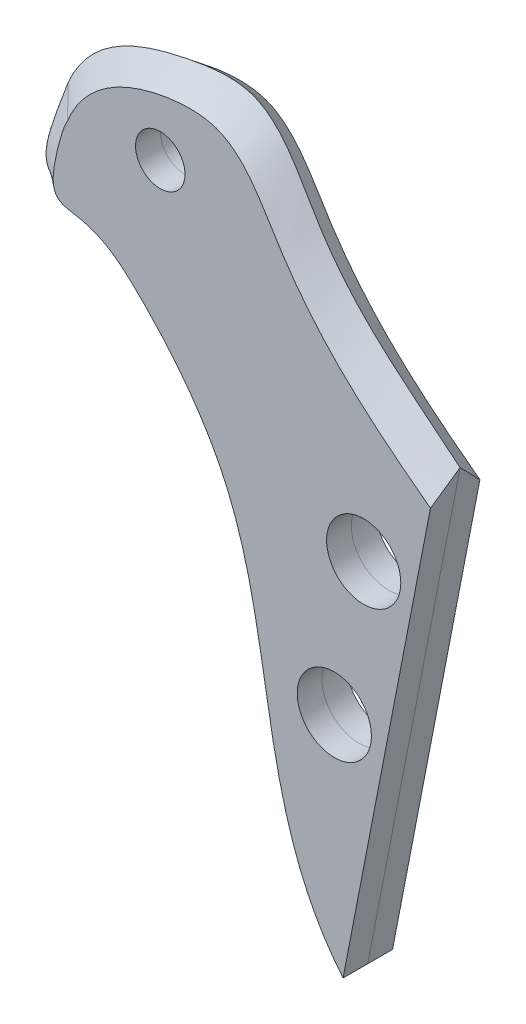
ISO-10303-21;
HEADER;
FILE_DESCRIPTION(('STEP AP214'),'2;1');
FILE_NAME('part.step','',(''),(''),'','','');
FILE_SCHEMA(('AUTOMOTIVE_DESIGN { 1 0 10303 214 1 1 1 1 }'));
ENDSEC;
DATA;
#1=APPLICATION_CONTEXT('core data for automotive mechanical design processes');
#2=APPLICATION_PROTOCOL_DEFINITION('international standard','automotive_design',2000,#1);
#3=PRODUCT_CONTEXT('',#1,'mechanical');
#4=PRODUCT('Part','Part','',(#3));
#5=PRODUCT_RELATED_PRODUCT_CATEGORY('part','',(#4));
#6=PRODUCT_DEFINITION_FORMATION('','',#4);
#7=PRODUCT_DEFINITION_CONTEXT('part definition',#1,'design');
#8=PRODUCT_DEFINITION('design','',#6,#7);
#9=PRODUCT_DEFINITION_SHAPE('','',#8);
#10=(LENGTH_UNIT() NAMED_UNIT(*) SI_UNIT(.MILLI.,.METRE.));
#11=(NAMED_UNIT(*) PLANE_ANGLE_UNIT() SI_UNIT($,.RADIAN.));
#12=(NAMED_UNIT(*) SI_UNIT($,.STERADIAN.) SOLID_ANGLE_UNIT());
#13=UNCERTAINTY_MEASURE_WITH_UNIT(LENGTH_MEASURE(1.E-05),#10,'distance_accuracy_value','');
#14=(GEOMETRIC_REPRESENTATION_CONTEXT(3) GLOBAL_UNCERTAINTY_ASSIGNED_CONTEXT((#13)) GLOBAL_UNIT_ASSIGNED_CONTEXT((#10,
#11,#12)) REPRESENTATION_CONTEXT('',''));
#15=CARTESIAN_POINT('',(0.,0.,0.));
#16=DIRECTION('',(0.,0.,1.));
#17=DIRECTION('',(1.,0.,0.));
#18=AXIS2_PLACEMENT_3D('',#15,#16,#17);
#19=CARTESIAN_POINT('',(0.,0.,30.013289283743));
#20=DIRECTION('',(0.,0.,-1.));
#21=DIRECTION('',(-1.,0.,0.));
#22=AXIS2_PLACEMENT_3D('',#19,#20,#21);
#23=PLANE('',#22);
#24=CARTESIAN_POINT('',(40.2778882950094,12.0174412329978,30.013289283743));
#25=DIRECTION('',(0.,0.,-1.));
#26=DIRECTION('',(-1.,0.,0.));
#27=AXIS2_PLACEMENT_3D('',#24,#25,#26);
#28=CIRCLE('',#27,1.7);
#29=CARTESIAN_POINT('',(38.5778882950094,12.0174412329978,30.013289283743));
#30=VERTEX_POINT('',#29);
#31=EDGE_CURVE('E248',#30,#30,#28,.F.);
#32=ORIENTED_EDGE('',*,*,#31,.T.);
#33=EDGE_LOOP('',(#32));
#34=FACE_BOUND('',#33,.T.);
#35=CARTESIAN_POINT('',(52.2416782887102,-15.017432758745,30.013289283743));
#36=DIRECTION('',(0.,0.,-1.));
#37=DIRECTION('',(-1.,0.,0.));
#38=AXIS2_PLACEMENT_3D('',#35,#36,#37);
#39=CIRCLE('',#38,2.54999999999999);
#40=CARTESIAN_POINT('',(49.6916782887102,-15.017432758745,30.013289283743));
#41=VERTEX_POINT('',#40);
#42=EDGE_CURVE('E180',#41,#41,#39,.F.);
#43=ORIENTED_EDGE('',*,*,#42,.T.);
#44=EDGE_LOOP('',(#43));
#45=FACE_BOUND('',#44,.T.);
#46=CARTESIAN_POINT('',(59.1866082842384,2.31655029087227,30.013289283743));
#47=CARTESIAN_POINT('',(55.5333547569396,5.37200350174671,30.013289283743));
#48=CARTESIAN_POINT('',(50.3563460795847,8.97370204998886,30.013289283743));
#49=CARTESIAN_POINT('',(46.4228075177713,18.1170294651366,30.013289283743));
#50=CARTESIAN_POINT('',(38.3922126218077,17.1644202277484,30.013289283743));
#51=CARTESIAN_POINT('',(33.8009564372788,15.3919532379688,30.013289283743));
#52=CARTESIAN_POINT('',(32.2359920814305,11.7483802516687,30.013289283743));
#53=B_SPLINE_CURVE_WITH_KNOTS('',3,(#46,#47,#48,#49,#50,#51,#52),.UNSPECIFIED.,.F.,.F.,(4,1,1,1,
4),(0.,0.379573755906784,0.583156846162769,0.702934632684244,1.),.UNSPECIFIED.);
#54=CARTESIAN_POINT('',(59.1866082842384,2.31655029087227,30.013289283743));
#55=VERTEX_POINT('',#54);
#56=CARTESIAN_POINT('',(32.2359920814305,11.7483802516687,30.013289283743));
#57=VERTEX_POINT('',#56);
#58=EDGE_CURVE('E61',#55,#57,#53,.T.);
#59=ORIENTED_EDGE('',*,*,#58,.F.);
#60=DIRECTION('',(-0.190360349727866,-0.98171428493808,0.));
#61=VECTOR('',#60,1.);
#62=CARTESIAN_POINT('',(57.4834926467632,-6.46664932291833,30.013289283743));
#63=LINE('',#62,#61);
#64=CARTESIAN_POINT('',(52.8448032906845,-30.3890029578152,30.013289283743));
#65=VERTEX_POINT('',#64);
#66=EDGE_CURVE('E95',#55,#65,#63,.T.);
#67=ORIENTED_EDGE('',*,*,#66,.T.);
#68=CARTESIAN_POINT('',(32.2359920814305,11.7483802516687,30.013289283743));
#69=CARTESIAN_POINT('',(32.0391638031607,11.1977834179729,30.013289283743));
#70=CARTESIAN_POINT('',(31.1172750102454,8.89558190594387,30.013289283743));
#71=CARTESIAN_POINT('',(30.1766496252198,5.20290054989083,30.013289283743));
#72=CARTESIAN_POINT('',(35.0316263190903,4.78377688389193,30.013289283743));
#73=CARTESIAN_POINT('',(39.758918338248,1.56715151651564,30.013289283743));
#74=CARTESIAN_POINT('',(47.9191438448916,-10.1862882712879,30.013289283743));
#75=CARTESIAN_POINT('',(46.7945352629169,-23.0216187639972,30.013289283743));
#76=CARTESIAN_POINT('',(52.8448032906845,-30.3890029578152,30.013289283743));
#77=B_SPLINE_CURVE_WITH_KNOTS('',3,(#68,#69,#70,#71,#72,#73,#74,#75,#76),.UNSPECIFIED.,.F.,.F.,
(4,1,1,1,1,1,4),(0.,0.0634739836974081,0.118425301735854,0.193565341111615,0.283413176700978,
0.473561281053638,1.),.UNSPECIFIED.);
#78=EDGE_CURVE('E13',#57,#65,#77,.T.);
#79=ORIENTED_EDGE('',*,*,#78,.F.);
#80=EDGE_LOOP('',(#59,#67,#79));
#81=FACE_BOUND('',#80,.T.);
#82=CARTESIAN_POINT('',(54.2604282887102,-4.8890029578152,30.013289283743));
#83=DIRECTION('',(0.,0.,-1.));
#84=DIRECTION('',(-1.,0.,0.));
#85=AXIS2_PLACEMENT_3D('',#82,#83,#84);
#86=CIRCLE('',#85,2.55);
#87=CARTESIAN_POINT('',(51.7104282887101,-4.8890029578152,30.013289283743));
#88=VERTEX_POINT('',#87);
#89=EDGE_CURVE('E253',#88,#88,#86,.F.);
#90=ORIENTED_EDGE('',*,*,#89,.T.);
#91=EDGE_LOOP('',(#90));
#92=FACE_BOUND('',#91,.T.);
#93=ADVANCED_FACE('F52',(#34,#45,#81,#92),#23,.T.);
#94=CARTESIAN_POINT('',(57.4834926467632,-6.46664932291833,17.730789283743));
#95=DIRECTION('',(-0.981714284938079,0.190360349727866,0.));
#96=DIRECTION('',(-0.190360349727866,-0.98171428493808,0.));
#97=AXIS2_PLACEMENT_3D('',#94,#95,#96);
#98=PLANE('',#97);
#99=ORIENTED_EDGE('',*,*,#66,.F.);
#100=DIRECTION('',(0.137169592660813,0.707402296574711,-0.693373271514046));
#101=VECTOR('',#100,1.);
#102=CARTESIAN_POINT('',(59.0184533256443,1.44935223638781,30.863289283743));
#103=LINE('',#102,#101);
#104=CARTESIAN_POINT('',(58.8502983670502,0.582154181903358,31.713289283743));
#105=VERTEX_POINT('',#104);
#106=EDGE_CURVE('E88',#105,#55,#103,.T.);
#107=ORIENTED_EDGE('',*,*,#106,.F.);
#108=DIRECTION('',(0.190360349727867,0.981714284938079,0.));
#109=VECTOR('',#108,1.);
#110=CARTESIAN_POINT('',(58.8502983670502,0.582154181903358,31.713289283743));
#111=LINE('',#110,#109);
#112=CARTESIAN_POINT('',(52.8448032906845,-30.3890029578152,31.713289283743));
#113=VERTEX_POINT('',#112);
#114=EDGE_CURVE('E93',#113,#105,#111,.T.);
#115=ORIENTED_EDGE('',*,*,#114,.F.);
#116=DIRECTION('',(0.,0.,1.));
#117=VECTOR('',#116,1.);
#118=CARTESIAN_POINT('',(52.8448032906845,-30.3890029578152,30.863289283743));
#119=LINE('',#118,#117);
#120=EDGE_CURVE('E166',#65,#113,#119,.T.);
#121=ORIENTED_EDGE('',*,*,#120,.F.);
#122=EDGE_LOOP('',(#99,#107,#115,#121));
#123=FACE_BOUND('',#122,.T.);
#124=ADVANCED_FACE('F90',(#123),#98,.F.);
#125=CARTESIAN_POINT('',(45.6690504757318,-7.32977099782672,31.713289283743));
#126=DIRECTION('',(0.,0.,-1.));
#127=DIRECTION('',(-1.,0.,0.));
#128=AXIS2_PLACEMENT_3D('',#125,#126,#127);
#129=PLANE('',#128);
#130=CARTESIAN_POINT('',(52.2416782887102,-15.017432758745,31.713289283743));
#131=DIRECTION('',(0.,0.,1.));
#132=DIRECTION('',(1.,0.,0.));
#133=AXIS2_PLACEMENT_3D('',#130,#131,#132);
#134=CIRCLE('',#133,2.54999999999999);
#135=CARTESIAN_POINT('',(54.7916782887101,-15.017432758745,31.713289283743));
#136=VERTEX_POINT('',#135);
#137=EDGE_CURVE('E167',#136,#136,#134,.T.);
#138=ORIENTED_EDGE('',*,*,#137,.F.);
#139=EDGE_LOOP('',(#138));
#140=FACE_BOUND('',#139,.T.);
#141=CARTESIAN_POINT('',(54.2604282887102,-4.8890029578152,31.713289283743));
#142=DIRECTION('',(0.,0.,1.));
#143=DIRECTION('',(1.,0.,0.));
#144=AXIS2_PLACEMENT_3D('',#141,#142,#143);
#145=CIRCLE('',#144,2.55);
#146=CARTESIAN_POINT('',(56.8104282887102,-4.8890029578152,31.713289283743));
#147=VERTEX_POINT('',#146);
#148=EDGE_CURVE('E239',#147,#147,#145,.T.);
#149=ORIENTED_EDGE('',*,*,#148,.F.);
#150=EDGE_LOOP('',(#149));
#151=FACE_BOUND('',#150,.T.);
#152=CARTESIAN_POINT('',(40.2778882950094,12.0174412329978,31.713289283743));
#153=DIRECTION('',(0.,0.,-1.));
#154=DIRECTION('',(-1.,0.,0.));
#155=AXIS2_PLACEMENT_3D('',#152,#153,#154);
#156=CIRCLE('',#155,1.7);
#157=CARTESIAN_POINT('',(38.5778882950094,12.0174412329978,31.713289283743));
#158=VERTEX_POINT('',#157);
#159=EDGE_CURVE('E97',#158,#158,#156,.T.);
#160=ORIENTED_EDGE('',*,*,#159,.T.);
#161=EDGE_LOOP('',(#160));
#162=FACE_BOUND('',#161,.T.);
#163=CARTESIAN_POINT('',(33.9072419780726,11.1608982302468,31.713289283743));
#164=CARTESIAN_POINT('',(33.6960790230969,10.8900327996302,31.713289283743));
#165=CARTESIAN_POINT('',(32.9632999997767,8.60805804038253,31.713289283743));
#166=CARTESIAN_POINT('',(32.7656863797307,5.95017231439694,31.713289283743));
#167=CARTESIAN_POINT('',(36.0475396281196,5.77660384822842,31.713289283743));
#168=CARTESIAN_POINT('',(40.1509390488213,2.23022416718721,31.713289283743));
#169=CARTESIAN_POINT('',(49.0161937001583,-8.99625873655049,31.713289283743));
#170=CARTESIAN_POINT('',(46.7768600490162,-23.0929190605882,31.713289283743));
#171=CARTESIAN_POINT('',(52.8448032906845,-30.3890029578152,31.713289283743));
#172=B_SPLINE_CURVE_WITH_KNOTS('',3,(#163,#164,#165,#166,#167,#168,#169,#170,#171),
.UNSPECIFIED.,.F.,.F.,(4,1,1,1,1,1,4),(0.,0.0618691743171781,0.104877433914272,
0.140990087097665,0.232652655485206,0.44215472429863,1.),.UNSPECIFIED.);
#173=CARTESIAN_POINT('',(33.9072419780726,11.1608982302468,31.713289283743));
#174=VERTEX_POINT('',#173);
#175=EDGE_CURVE('E113',#174,#113,#172,.T.);
#176=ORIENTED_EDGE('',*,*,#175,.T.);
#177=ORIENTED_EDGE('',*,*,#114,.T.);
#178=CARTESIAN_POINT('',(58.8502983670502,0.582154181903358,31.713289283743));
#179=CARTESIAN_POINT('',(54.6375536116588,3.72911890341942,31.713289283743));
#180=CARTESIAN_POINT('',(49.7861220121252,7.82016955184531,31.713289283743));
#181=CARTESIAN_POINT('',(45.5580551972648,16.2243115229969,31.713289283743));
#182=CARTESIAN_POINT('',(38.8669179019402,16.1253118462174,31.713289283743));
#183=CARTESIAN_POINT('',(35.0563370192907,14.0514408900861,31.713289283743));
#184=CARTESIAN_POINT('',(33.9072419780726,11.1608982302468,31.713289283743));
#185=B_SPLINE_CURVE_WITH_KNOTS('',3,(#178,#179,#180,#181,#182,#183,#184),.UNSPECIFIED.,.F.,.F.,
(4,1,1,1,4),(0.,0.443669854560584,0.631844867473527,0.739701273066536,1.),.UNSPECIFIED.);
#186=EDGE_CURVE('E101',#105,#174,#185,.T.);
#187=ORIENTED_EDGE('',*,*,#186,.T.);
#188=EDGE_LOOP('',(#176,#177,#187));
#189=FACE_BOUND('',#188,.T.);
#190=ADVANCED_FACE('F112',(#140,#151,#162,#189),#129,.F.);
#191=CARTESIAN_POINT('',(32.2359920814305,11.7483802516687,30.013289283743));
#192=CARTESIAN_POINT('',(33.9072419780726,11.1608982302468,31.713289283743));
#193=CARTESIAN_POINT('',(32.0441402021333,11.2117041286637,30.013289283743));
#194=CARTESIAN_POINT('',(33.6960790230969,10.8900327996302,31.713289283743));
#195=CARTESIAN_POINT('',(31.5575395421801,9.99503953999069,30.013289283743));
#196=CARTESIAN_POINT('',(33.252586061417,9.5089346619242,31.713289283743));
#197=CARTESIAN_POINT('',(30.901384361174,7.97609570288549,30.013289283743));
#198=CARTESIAN_POINT('',(32.8743340025538,7.41147323989284,31.713289283743));
#199=CARTESIAN_POINT('',(30.6076260406025,6.89481594928121,30.013289283743));
#200=CARTESIAN_POINT('',(32.8187157287241,6.36576028868581,31.713289283743));
#201=CARTESIAN_POINT('',(30.8954084548017,5.83965979232856,30.013289283743));
#202=CARTESIAN_POINT('',(33.8524947128075,5.89269391999161,31.713289283743));
#203=CARTESIAN_POINT('',(31.8877538184674,5.05518320589504,30.013289283743));
#204=CARTESIAN_POINT('',(35.4904654784108,5.71324151605375,31.713289283743));
#205=CARTESIAN_POINT('',(34.2723296968009,4.7257787669229,30.013289283743));
#206=CARTESIAN_POINT('',(37.126538770345,4.84407443991782,31.713289283743));
#207=CARTESIAN_POINT('',(36.5521313909395,3.74916866305139,30.013289283743));
#208=CARTESIAN_POINT('',(38.8133976572541,3.28302426988339,31.713289283743));
#209=CARTESIAN_POINT('',(39.7503754207592,1.30612283839873,30.013289283743));
#210=CARTESIAN_POINT('',(41.6207904889491,0.368883155269356,31.713289283743));
#211=CARTESIAN_POINT('',(42.2743675479331,-2.05593228199478,30.013289283743));
#212=CARTESIAN_POINT('',(43.8960701658193,-2.86406152662291,31.713289283743));
#213=CARTESIAN_POINT('',(47.6700154756001,-13.0296286176255,30.013289283743));
#214=CARTESIAN_POINT('',(48.3131551141228,-13.4219038997801,31.713289283743));
#215=CARTESIAN_POINT('',(46.7945352629169,-23.0216187639972,30.013289283743));
#216=CARTESIAN_POINT('',(47.1184838147925,-23.5036868540762,31.713289283743));
#217=CARTESIAN_POINT('',(52.8448032906845,-30.3890029578152,30.013289283743));
#218=CARTESIAN_POINT('',(52.8448032906845,-30.3890029578152,31.713289283743));
#219=B_SPLINE_SURFACE_WITH_KNOTS('',3,1,((#191,#192),(#193,#194),(#195,#196),(#197,#198),(#199,
#200),(#201,#202),(#203,#204),(#205,#206),(#207,#208),(#209,#210),(#211,#212),(#213,#214),(#215,
#216),(#217,#218)),.UNSPECIFIED.,.F.,.F.,.F.,(4,1,1,1,1,1,1,1,1,1,1,4),(2,2),(0.,
0.0618691743171781,0.0634739836974081,0.104877433914272,0.118425301735854,0.140990087097665,
0.193565341111615,0.232652655485206,0.283413176700978,0.44215472429863,0.473561281053638,1.),
(0.,1.),.UNSPECIFIED.);
#220=DIRECTION('',(0.680686533146075,-0.239276664280315,0.692396217150602));
#221=VECTOR('',#220,1.);
#222=CARTESIAN_POINT('',(33.0716170297516,11.4546392409578,30.863289283743));
#223=LINE('',#222,#221);
#224=EDGE_CURVE('E98',#57,#174,#223,.T.);
#225=ORIENTED_EDGE('',*,*,#78,.T.);
#226=ORIENTED_EDGE('',*,*,#120,.T.);
#227=ORIENTED_EDGE('',*,*,#175,.F.);
#228=ORIENTED_EDGE('',*,*,#224,.F.);
#229=EDGE_LOOP('',(#225,#226,#227,#228));
#230=FACE_BOUND('',#229,.T.);
#231=ADVANCED_FACE('F132',(#230),#219,.T.);
#232=CARTESIAN_POINT('',(59.1866082842384,2.31655029087227,30.013289283743));
#233=CARTESIAN_POINT('',(58.8502983670502,0.582154181903358,31.713289283743));
#234=CARTESIAN_POINT('',(55.5333547569396,5.37200350174671,30.013289283743));
#235=CARTESIAN_POINT('',(55.2461604409695,3.2744831890996,31.713289283743));
#236=CARTESIAN_POINT('',(51.5946499264045,8.11220124028726,30.013289283743));
#237=CARTESIAN_POINT('',(51.7231101959465,6.18677194480138,31.713289283743));
#238=CARTESIAN_POINT('',(47.8736223660526,14.744677836155,30.013289283743));
#239=CARTESIAN_POINT('',(47.9329539294505,11.6745344007484,31.713289283743));
#240=CARTESIAN_POINT('',(46.0945183802308,17.2988517696202,30.013289283743));
#241=CARTESIAN_POINT('',(46.4528492452718,14.4457265233554,31.713289283743));
#242=CARTESIAN_POINT('',(43.1574925504654,17.729689642728,30.013289283743));
#243=CARTESIAN_POINT('',(44.1998997690521,15.9816749883543,31.713289283743));
#244=CARTESIAN_POINT('',(41.1665096117991,17.4396555021939,30.013289283743));
#245=CARTESIAN_POINT('',(42.4398056461874,16.1781750167425,31.713289283743));
#246=CARTESIAN_POINT('',(36.6679775910553,16.498774584857,30.013289283743));
#247=CARTESIAN_POINT('',(38.1311049895818,15.7248529463592,31.713289283743));
#248=CARTESIAN_POINT('',(33.6072668052544,14.9410021934079,30.013289283743));
#249=CARTESIAN_POINT('',(35.0563370192907,14.0514408900861,31.713289283743));
#250=CARTESIAN_POINT('',(32.2359920814305,11.7483802516687,30.013289283743));
#251=CARTESIAN_POINT('',(33.9072419780726,11.1608982302468,31.713289283743));
#252=B_SPLINE_SURFACE_WITH_KNOTS('',3,1,((#232,#233),(#234,#235),(#236,#237),(#238,#239),(#240,
#241),(#242,#243),(#244,#245),(#246,#247),(#248,#249),(#250,#251)),.UNSPECIFIED.,.F.,.F.,.F.,(4,
1,1,1,1,1,1,4),(2,2),(0.,0.379573755906784,0.443669854560584,0.583156846162769,
0.631844867473527,0.702934632684244,0.739701273066536,1.),(0.,1.),.UNSPECIFIED.);
#253=ORIENTED_EDGE('',*,*,#58,.T.);
#254=ORIENTED_EDGE('',*,*,#224,.T.);
#255=ORIENTED_EDGE('',*,*,#186,.F.);
#256=ORIENTED_EDGE('',*,*,#106,.T.);
#257=EDGE_LOOP('',(#253,#254,#255,#256));
#258=FACE_BOUND('',#257,.T.);
#259=ADVANCED_FACE('F103',(#258),#252,.T.);
#260=CARTESIAN_POINT('',(52.2416782887102,-15.017432758745,12.6008001156402));
#261=DIRECTION('',(0.,0.,1.));
#262=DIRECTION('',(1.,0.,0.));
#263=AXIS2_PLACEMENT_3D('',#260,#261,#262);
#264=CYLINDRICAL_SURFACE('',#263,2.54999999999999);
#265=ORIENTED_EDGE('',*,*,#137,.T.);
#266=EDGE_LOOP('',(#265));
#267=FACE_BOUND('',#266,.T.);
#268=ORIENTED_EDGE('',*,*,#42,.F.);
#269=EDGE_LOOP('',(#268));
#270=FACE_BOUND('',#269,.T.);
#271=ADVANCED_FACE('F54',(#267,#270),#264,.F.);
#272=CARTESIAN_POINT('',(54.2604282887102,-4.8890029578152,12.6008001156402));
#273=DIRECTION('',(0.,0.,1.));
#274=DIRECTION('',(1.,0.,0.));
#275=AXIS2_PLACEMENT_3D('',#272,#273,#274);
#276=CYLINDRICAL_SURFACE('',#275,2.55);
#277=ORIENTED_EDGE('',*,*,#148,.T.);
#278=EDGE_LOOP('',(#277));
#279=FACE_BOUND('',#278,.T.);
#280=ORIENTED_EDGE('',*,*,#89,.F.);
#281=EDGE_LOOP('',(#280));
#282=FACE_BOUND('',#281,.T.);
#283=ADVANCED_FACE('F263',(#279,#282),#276,.F.);
#284=CARTESIAN_POINT('',(40.2778882950094,12.0174412329978,32.138289283743));
#285=DIRECTION('',(0.,0.,-1.));
#286=DIRECTION('',(-1.,0.,0.));
#287=AXIS2_PLACEMENT_3D('',#284,#285,#286);
#288=CYLINDRICAL_SURFACE('',#287,1.7);
#289=ORIENTED_EDGE('',*,*,#159,.F.);
#290=EDGE_LOOP('',(#289));
#291=FACE_BOUND('',#290,.T.);
#292=ORIENTED_EDGE('',*,*,#31,.F.);
#293=EDGE_LOOP('',(#292));
#294=FACE_BOUND('',#293,.T.);
#295=ADVANCED_FACE('F191',(#291,#294),#288,.F.);
#296=CLOSED_SHELL('',(#93,#124,#190,#231,#259,#271,#283,#295));
#297=MANIFOLD_SOLID_BREP('B2',#296);
#298=CARTESIAN_POINT('',(0.,0.,30.013289283743));
#299=DIRECTION('',(0.,0.,-1.));
#300=DIRECTION('',(-1.,0.,0.));
#301=AXIS2_PLACEMENT_3D('',#298,#299,#300);
#302=PLANE('',#301);
#303=CARTESIAN_POINT('',(54.2604282887102,-4.8890029578152,30.013289283743));
#304=DIRECTION('',(0.,0.,-1.));
#305=DIRECTION('',(-1.,0.,0.));
#306=AXIS2_PLACEMENT_3D('',#303,#304,#305);
#307=CIRCLE('',#306,2.55);
#308=CARTESIAN_POINT('',(51.7104282887101,-4.8890029578152,30.013289283743));
#309=VERTEX_POINT('',#308);
#310=EDGE_CURVE('E470',#309,#309,#307,.F.);
#311=ORIENTED_EDGE('',*,*,#310,.F.);
#312=EDGE_LOOP('',(#311));
#313=FACE_BOUND('',#312,.T.);
#314=CARTESIAN_POINT('',(59.1866082842384,2.31655029087227,30.013289283743));
#315=CARTESIAN_POINT('',(55.5333547569396,5.37200350174671,30.013289283743));
#316=CARTESIAN_POINT('',(50.3563460795847,8.97370204998886,30.013289283743));
#317=CARTESIAN_POINT('',(46.4228075177713,18.1170294651366,30.013289283743));
#318=CARTESIAN_POINT('',(38.3922126218077,17.1644202277484,30.013289283743));
#319=CARTESIAN_POINT('',(33.8009564372788,15.3919532379688,30.013289283743));
#320=CARTESIAN_POINT('',(32.2359920814305,11.7483802516687,30.013289283743));
#321=B_SPLINE_CURVE_WITH_KNOTS('',3,(#314,#315,#316,#317,#318,#319,#320),.UNSPECIFIED.,.F.,.F.,
(4,1,1,1,4),(0.,0.379573755906784,0.583156846162769,0.702934632684244,1.),.UNSPECIFIED.);
#322=CARTESIAN_POINT('',(59.1866082842384,2.31655029087227,30.013289283743));
#323=VERTEX_POINT('',#322);
#324=CARTESIAN_POINT('',(32.2359920814305,11.7483802516687,30.013289283743));
#325=VERTEX_POINT('',#324);
#326=EDGE_CURVE('E361',#323,#325,#321,.T.);
#327=ORIENTED_EDGE('',*,*,#326,.T.);
#328=CARTESIAN_POINT('',(52.8448032906845,-30.3890029578152,30.013289283743));
#329=CARTESIAN_POINT('',(46.7945352629169,-23.0216187639972,30.013289283743));
#330=CARTESIAN_POINT('',(47.6700154756001,-13.0296286176255,30.013289283743));
#331=CARTESIAN_POINT('',(42.2743675479331,-2.05593228199478,30.013289283743));
#332=CARTESIAN_POINT('',(39.7503754207592,1.30612283839873,30.013289283743));
#333=CARTESIAN_POINT('',(36.5521313909395,3.74916866305139,30.013289283743));
#334=CARTESIAN_POINT('',(34.2723296968009,4.7257787669229,30.013289283743));
#335=CARTESIAN_POINT('',(31.8877538184674,5.05518320589504,30.013289283743));
#336=CARTESIAN_POINT('',(30.8954084548017,5.83965979232856,30.013289283743));
#337=CARTESIAN_POINT('',(30.6076260406025,6.89481594928121,30.013289283743));
#338=CARTESIAN_POINT('',(30.901384361174,7.97609570288549,30.013289283743));
#339=CARTESIAN_POINT('',(31.5575395421801,9.99503953999069,30.013289283743));
#340=CARTESIAN_POINT('',(32.0441402021333,11.2117041286637,30.013289283743));
#341=CARTESIAN_POINT('',(32.2359920814305,11.7483802516687,30.013289283743));
#342=B_SPLINE_CURVE_WITH_KNOTS('',3,(#328,#329,#330,#331,#332,#333,#334,#335,#336,#337,#338,
#339,#340,#341),.UNSPECIFIED.,.F.,.F.,(4,1,1,1,1,1,1,1,1,1,1,4),(0.,0.526438718946362,
0.55784527570137,0.716586823299022,0.767347344514794,0.806434658888385,0.859009912902335,
0.881574698264146,0.895122566085728,0.936526016302592,0.938130825682822,1.),.UNSPECIFIED.);
#343=CARTESIAN_POINT('',(52.8448032906845,-30.3890029578152,30.013289283743));
#344=VERTEX_POINT('',#343);
#345=EDGE_CURVE('E50',#325,#344,#342,.F.);
#346=ORIENTED_EDGE('',*,*,#345,.T.);
#347=DIRECTION('',(-0.190360349727866,-0.98171428493808,0.));
#348=VECTOR('',#347,1.);
#349=CARTESIAN_POINT('',(57.4834926467632,-6.46664932291833,30.013289283743));
#350=LINE('',#349,#348);
#351=EDGE_CURVE('E381',#323,#344,#350,.T.);
#352=ORIENTED_EDGE('',*,*,#351,.F.);
#353=EDGE_LOOP('',(#327,#346,#352));
#354=FACE_BOUND('',#353,.T.);
#355=CARTESIAN_POINT('',(52.2416782887102,-15.017432758745,30.013289283743));
#356=DIRECTION('',(0.,0.,-1.));
#357=DIRECTION('',(-1.,0.,0.));
#358=AXIS2_PLACEMENT_3D('',#355,#356,#357);
#359=CIRCLE('',#358,2.54999999999999);
#360=CARTESIAN_POINT('',(49.6916782887102,-15.017432758745,30.013289283743));
#361=VERTEX_POINT('',#360);
#362=EDGE_CURVE('E466',#361,#361,#359,.F.);
#363=ORIENTED_EDGE('',*,*,#362,.F.);
#364=EDGE_LOOP('',(#363));
#365=FACE_BOUND('',#364,.T.);
#366=CARTESIAN_POINT('',(40.2778882950094,12.0174412329978,30.013289283743));
#367=DIRECTION('',(0.,0.,-1.));
#368=DIRECTION('',(-1.,0.,0.));
#369=AXIS2_PLACEMENT_3D('',#366,#367,#368);
#370=CIRCLE('',#369,1.7);
#371=CARTESIAN_POINT('',(38.5778882950094,12.0174412329978,30.013289283743));
#372=VERTEX_POINT('',#371);
#373=EDGE_CURVE('E629',#372,#372,#370,.F.);
#374=ORIENTED_EDGE('',*,*,#373,.F.);
#375=EDGE_LOOP('',(#374));
#376=FACE_BOUND('',#375,.T.);
#377=ADVANCED_FACE('F357',(#313,#354,#365,#376),#302,.F.);
#378=CARTESIAN_POINT('',(57.4834926467632,-6.46664932291833,17.730789283743));
#379=DIRECTION('',(-0.981714284938079,0.190360349727866,0.));
#380=DIRECTION('',(-0.190360349727866,-0.98171428493808,0.));
#381=AXIS2_PLACEMENT_3D('',#378,#379,#380);
#382=PLANE('',#381);
#383=DIRECTION('',(0.137169592660813,0.707402296574711,0.693373271514046));
#384=VECTOR('',#383,1.);
#385=CARTESIAN_POINT('',(59.0184533256443,1.44935223638781,29.163289283743));
#386=LINE('',#385,#384);
#387=CARTESIAN_POINT('',(58.8502983670502,0.582154181903358,28.313289283743));
#388=VERTEX_POINT('',#387);
#389=EDGE_CURVE('E464',#388,#323,#386,.T.);
#390=ORIENTED_EDGE('',*,*,#389,.T.);
#391=ORIENTED_EDGE('',*,*,#351,.T.);
#392=DIRECTION('',(0.,0.,-1.));
#393=VECTOR('',#392,1.);
#394=CARTESIAN_POINT('',(52.8448032906845,-30.3890029578152,29.163289283743));
#395=LINE('',#394,#393);
#396=CARTESIAN_POINT('',(52.8448032906845,-30.3890029578152,28.313289283743));
#397=VERTEX_POINT('',#396);
#398=EDGE_CURVE('E409',#344,#397,#395,.T.);
#399=ORIENTED_EDGE('',*,*,#398,.T.);
#400=DIRECTION('',(0.190360349727867,0.981714284938079,0.));
#401=VECTOR('',#400,1.);
#402=CARTESIAN_POINT('',(58.8502983670502,0.582154181903358,28.313289283743));
#403=LINE('',#402,#401);
#404=EDGE_CURVE('E396',#397,#388,#403,.T.);
#405=ORIENTED_EDGE('',*,*,#404,.T.);
#406=EDGE_LOOP('',(#390,#391,#399,#405));
#407=FACE_BOUND('',#406,.T.);
#408=ADVANCED_FACE('F410',(#407),#382,.F.);
#409=CARTESIAN_POINT('',(40.2778882950094,12.0174412329978,32.138289283743));
#410=DIRECTION('',(0.,0.,-1.));
#411=DIRECTION('',(-1.,0.,0.));
#412=AXIS2_PLACEMENT_3D('',#409,#410,#411);
#413=CYLINDRICAL_SURFACE('',#412,1.7);
#414=ORIENTED_EDGE('',*,*,#373,.T.);
#415=EDGE_LOOP('',(#414));
#416=FACE_BOUND('',#415,.T.);
#417=CARTESIAN_POINT('',(40.2778882950094,12.0174412329978,28.313289283743));
#418=DIRECTION('',(0.,0.,-1.));
#419=DIRECTION('',(-1.,0.,0.));
#420=AXIS2_PLACEMENT_3D('',#417,#418,#419);
#421=CIRCLE('',#420,1.7);
#422=CARTESIAN_POINT('',(38.5778882950094,12.0174412329978,28.313289283743));
#423=VERTEX_POINT('',#422);
#424=EDGE_CURVE('E555',#423,#423,#421,.T.);
#425=ORIENTED_EDGE('',*,*,#424,.T.);
#426=EDGE_LOOP('',(#425));
#427=FACE_BOUND('',#426,.T.);
#428=ADVANCED_FACE('F520',(#416,#427),#413,.F.);
#429=CARTESIAN_POINT('',(54.2604282887102,-4.8890029578152,12.6008001156402));
#430=DIRECTION('',(0.,0.,1.));
#431=DIRECTION('',(1.,0.,0.));
#432=AXIS2_PLACEMENT_3D('',#429,#430,#431);
#433=CYLINDRICAL_SURFACE('',#432,2.55);
#434=ORIENTED_EDGE('',*,*,#310,.T.);
#435=EDGE_LOOP('',(#434));
#436=FACE_BOUND('',#435,.T.);
#437=CARTESIAN_POINT('',(54.2604282887102,-4.8890029578152,28.313289283743));
#438=DIRECTION('',(0.,0.,1.));
#439=DIRECTION('',(1.,0.,0.));
#440=AXIS2_PLACEMENT_3D('',#437,#438,#439);
#441=CIRCLE('',#440,2.55);
#442=CARTESIAN_POINT('',(56.8104282887102,-4.8890029578152,28.313289283743));
#443=VERTEX_POINT('',#442);
#444=EDGE_CURVE('E552',#443,#443,#441,.T.);
#445=ORIENTED_EDGE('',*,*,#444,.F.);
#446=EDGE_LOOP('',(#445));
#447=FACE_BOUND('',#446,.T.);
#448=ADVANCED_FACE('F523',(#436,#447),#433,.F.);
#449=CARTESIAN_POINT('',(52.2416782887102,-15.017432758745,12.6008001156402));
#450=DIRECTION('',(0.,0.,1.));
#451=DIRECTION('',(1.,0.,0.));
#452=AXIS2_PLACEMENT_3D('',#449,#450,#451);
#453=CYLINDRICAL_SURFACE('',#452,2.54999999999999);
#454=ORIENTED_EDGE('',*,*,#362,.T.);
#455=EDGE_LOOP('',(#454));
#456=FACE_BOUND('',#455,.T.);
#457=CARTESIAN_POINT('',(52.2416782887102,-15.017432758745,28.313289283743));
#458=DIRECTION('',(0.,0.,1.));
#459=DIRECTION('',(1.,0.,0.));
#460=AXIS2_PLACEMENT_3D('',#457,#458,#459);
#461=CIRCLE('',#460,2.54999999999999);
#462=CARTESIAN_POINT('',(54.7916782887101,-15.017432758745,28.313289283743));
#463=VERTEX_POINT('',#462);
#464=EDGE_CURVE('E548',#463,#463,#461,.T.);
#465=ORIENTED_EDGE('',*,*,#464,.F.);
#466=EDGE_LOOP('',(#465));
#467=FACE_BOUND('',#466,.T.);
#468=ADVANCED_FACE('F438',(#456,#467),#453,.F.);
#469=CARTESIAN_POINT('',(32.2359920814305,11.7483802516687,30.013289283743));
#470=CARTESIAN_POINT('',(33.9072419780726,11.1608982302468,28.313289283743));
#471=CARTESIAN_POINT('',(32.0441402021333,11.2117041286637,30.013289283743));
#472=CARTESIAN_POINT('',(33.6960790230969,10.8900327996302,28.313289283743));
#473=CARTESIAN_POINT('',(31.5575395421801,9.99503953999069,30.013289283743));
#474=CARTESIAN_POINT('',(33.252586061417,9.5089346619242,28.313289283743));
#475=CARTESIAN_POINT('',(30.901384361174,7.97609570288549,30.013289283743));
#476=CARTESIAN_POINT('',(32.8743340025538,7.41147323989284,28.313289283743));
#477=CARTESIAN_POINT('',(30.6076260406025,6.89481594928121,30.013289283743));
#478=CARTESIAN_POINT('',(32.8187157287241,6.36576028868581,28.313289283743));
#479=CARTESIAN_POINT('',(30.8954084548017,5.83965979232856,30.013289283743));
#480=CARTESIAN_POINT('',(33.8524947128075,5.89269391999161,28.313289283743));
#481=CARTESIAN_POINT('',(31.8877538184674,5.05518320589504,30.013289283743));
#482=CARTESIAN_POINT('',(35.4904654784108,5.71324151605375,28.313289283743));
#483=CARTESIAN_POINT('',(34.2723296968009,4.7257787669229,30.013289283743));
#484=CARTESIAN_POINT('',(37.126538770345,4.84407443991782,28.313289283743));
#485=CARTESIAN_POINT('',(36.5521313909395,3.74916866305139,30.013289283743));
#486=CARTESIAN_POINT('',(38.8133976572541,3.28302426988339,28.313289283743));
#487=CARTESIAN_POINT('',(39.7503754207592,1.30612283839873,30.013289283743));
#488=CARTESIAN_POINT('',(41.6207904889491,0.368883155269356,28.313289283743));
#489=CARTESIAN_POINT('',(42.2743675479331,-2.05593228199478,30.013289283743));
#490=CARTESIAN_POINT('',(43.8960701658193,-2.86406152662291,28.313289283743));
#491=CARTESIAN_POINT('',(47.6700154756001,-13.0296286176255,30.013289283743));
#492=CARTESIAN_POINT('',(48.3131551141228,-13.4219038997801,28.313289283743));
#493=CARTESIAN_POINT('',(46.7945352629169,-23.0216187639972,30.013289283743));
#494=CARTESIAN_POINT('',(47.1184838147925,-23.5036868540762,28.313289283743));
#495=CARTESIAN_POINT('',(52.8448032906845,-30.3890029578152,30.013289283743));
#496=CARTESIAN_POINT('',(52.8448032906845,-30.3890029578152,28.313289283743));
#497=B_SPLINE_SURFACE_WITH_KNOTS('',3,1,((#469,#470),(#471,#472),(#473,#474),(#475,#476),(#477,
#478),(#479,#480),(#481,#482),(#483,#484),(#485,#486),(#487,#488),(#489,#490),(#491,#492),(#493,
#494),(#495,#496)),.UNSPECIFIED.,.F.,.F.,.F.,(4,1,1,1,1,1,1,1,1,1,1,4),(2,2),(0.,
0.0618691743171781,0.0634739836974081,0.104877433914272,0.118425301735854,0.140990087097665,
0.193565341111615,0.232652655485206,0.283413176700978,0.44215472429863,0.473561281053638,1.),
(0.,1.),.UNSPECIFIED.);
#498=DIRECTION('',(0.680686533146075,-0.239276664280315,-0.692396217150602));
#499=VECTOR('',#498,1.);
#500=CARTESIAN_POINT('',(33.0716170297516,11.4546392409578,29.163289283743));
#501=LINE('',#500,#499);
#502=CARTESIAN_POINT('',(33.9072419780726,11.1608982302468,28.313289283743));
#503=VERTEX_POINT('',#502);
#504=EDGE_CURVE('E412',#325,#503,#501,.T.);
#505=CARTESIAN_POINT('',(33.9072419780726,11.1608982302468,28.313289283743));
#506=CARTESIAN_POINT('',(33.6960790230969,10.8900327996302,28.313289283743));
#507=CARTESIAN_POINT('',(32.9632999997767,8.60805804038253,28.313289283743));
#508=CARTESIAN_POINT('',(32.7656863797307,5.95017231439694,28.313289283743));
#509=CARTESIAN_POINT('',(36.0475396281196,5.77660384822842,28.313289283743));
#510=CARTESIAN_POINT('',(40.1509390488213,2.23022416718721,28.313289283743));
#511=CARTESIAN_POINT('',(49.0161937001583,-8.99625873655049,28.313289283743));
#512=CARTESIAN_POINT('',(46.7768600490162,-23.0929190605882,28.313289283743));
#513=CARTESIAN_POINT('',(52.8448032906845,-30.3890029578152,28.313289283743));
#514=B_SPLINE_CURVE_WITH_KNOTS('',3,(#505,#506,#507,#508,#509,#510,#511,#512,#513),
.UNSPECIFIED.,.F.,.F.,(4,1,1,1,1,1,4),(0.,0.0618691743171781,0.104877433914272,
0.140990087097665,0.232652655485206,0.44215472429863,1.),.UNSPECIFIED.);
#515=EDGE_CURVE('E400',#503,#397,#514,.T.);
#516=ORIENTED_EDGE('',*,*,#345,.F.);
#517=ORIENTED_EDGE('',*,*,#504,.T.);
#518=ORIENTED_EDGE('',*,*,#515,.T.);
#519=ORIENTED_EDGE('',*,*,#398,.F.);
#520=EDGE_LOOP('',(#516,#517,#518,#519));
#521=FACE_BOUND('',#520,.T.);
#522=ADVANCED_FACE('F415',(#521),#497,.F.);
#523=CARTESIAN_POINT('',(45.6690504757318,-7.32977099782672,28.313289283743));
#524=DIRECTION('',(0.,0.,1.));
#525=DIRECTION('',(-1.,0.,0.));
#526=AXIS2_PLACEMENT_3D('',#523,#524,#525);
#527=PLANE('',#526);
#528=ORIENTED_EDGE('',*,*,#464,.T.);
#529=EDGE_LOOP('',(#528));
#530=FACE_BOUND('',#529,.T.);
#531=ORIENTED_EDGE('',*,*,#444,.T.);
#532=EDGE_LOOP('',(#531));
#533=FACE_BOUND('',#532,.T.);
#534=ORIENTED_EDGE('',*,*,#424,.F.);
#535=EDGE_LOOP('',(#534));
#536=FACE_BOUND('',#535,.T.);
#537=ORIENTED_EDGE('',*,*,#515,.F.);
#538=CARTESIAN_POINT('',(58.8502983670502,0.582154181903358,28.313289283743));
#539=CARTESIAN_POINT('',(54.6375536116588,3.72911890341942,28.313289283743));
#540=CARTESIAN_POINT('',(49.7861220121252,7.82016955184531,28.313289283743));
#541=CARTESIAN_POINT('',(45.5580551972648,16.2243115229969,28.313289283743));
#542=CARTESIAN_POINT('',(38.8669179019402,16.1253118462174,28.313289283743));
#543=CARTESIAN_POINT('',(35.0563370192907,14.0514408900861,28.313289283743));
#544=CARTESIAN_POINT('',(33.9072419780726,11.1608982302468,28.313289283743));
#545=B_SPLINE_CURVE_WITH_KNOTS('',3,(#538,#539,#540,#541,#542,#543,#544),.UNSPECIFIED.,.F.,.F.,
(4,1,1,1,4),(0.,0.443669854560584,0.631844867473527,0.739701273066536,1.),.UNSPECIFIED.);
#546=EDGE_CURVE('E402',#388,#503,#545,.T.);
#547=ORIENTED_EDGE('',*,*,#546,.F.);
#548=ORIENTED_EDGE('',*,*,#404,.F.);
#549=EDGE_LOOP('',(#537,#547,#548));
#550=FACE_BOUND('',#549,.T.);
#551=ADVANCED_FACE('F398',(#530,#533,#536,#550),#527,.F.);
#552=CARTESIAN_POINT('',(59.1866082842384,2.31655029087227,30.013289283743));
#553=CARTESIAN_POINT('',(58.8502983670502,0.582154181903358,28.313289283743));
#554=CARTESIAN_POINT('',(55.5333547569396,5.37200350174671,30.013289283743));
#555=CARTESIAN_POINT('',(55.2461604409695,3.2744831890996,28.313289283743));
#556=CARTESIAN_POINT('',(51.5946499264045,8.11220124028726,30.013289283743));
#557=CARTESIAN_POINT('',(51.7231101959465,6.18677194480138,28.313289283743));
#558=CARTESIAN_POINT('',(47.8736223660526,14.744677836155,30.013289283743));
#559=CARTESIAN_POINT('',(47.9329539294505,11.6745344007484,28.313289283743));
#560=CARTESIAN_POINT('',(46.0945183802308,17.2988517696202,30.013289283743));
#561=CARTESIAN_POINT('',(46.4528492452718,14.4457265233554,28.313289283743));
#562=CARTESIAN_POINT('',(43.1574925504654,17.729689642728,30.013289283743));
#563=CARTESIAN_POINT('',(44.1998997690521,15.9816749883543,28.313289283743));
#564=CARTESIAN_POINT('',(41.1665096117991,17.4396555021939,30.013289283743));
#565=CARTESIAN_POINT('',(42.4398056461874,16.1781750167425,28.313289283743));
#566=CARTESIAN_POINT('',(36.6679775910553,16.498774584857,30.013289283743));
#567=CARTESIAN_POINT('',(38.1311049895818,15.7248529463592,28.313289283743));
#568=CARTESIAN_POINT('',(33.6072668052544,14.9410021934079,30.013289283743));
#569=CARTESIAN_POINT('',(35.0563370192907,14.0514408900861,28.313289283743));
#570=CARTESIAN_POINT('',(32.2359920814305,11.7483802516687,30.013289283743));
#571=CARTESIAN_POINT('',(33.9072419780726,11.1608982302468,28.313289283743));
#572=B_SPLINE_SURFACE_WITH_KNOTS('',3,1,((#552,#553),(#554,#555),(#556,#557),(#558,#559),(#560,
#561),(#562,#563),(#564,#565),(#566,#567),(#568,#569),(#570,#571)),.UNSPECIFIED.,.F.,.F.,.F.,(4,
1,1,1,1,1,1,4),(2,2),(0.,0.379573755906784,0.443669854560584,0.583156846162769,
0.631844867473527,0.702934632684244,0.739701273066536,1.),(0.,1.),.UNSPECIFIED.);
#573=ORIENTED_EDGE('',*,*,#326,.F.);
#574=ORIENTED_EDGE('',*,*,#389,.F.);
#575=ORIENTED_EDGE('',*,*,#546,.T.);
#576=ORIENTED_EDGE('',*,*,#504,.F.);
#577=EDGE_LOOP('',(#573,#574,#575,#576));
#578=FACE_BOUND('',#577,.T.);
#579=ADVANCED_FACE('F439',(#578),#572,.F.);
#580=CLOSED_SHELL('',(#377,#408,#428,#448,#468,#522,#551,#579));
#581=MANIFOLD_SOLID_BREP('B7',#580);
#582=ADVANCED_BREP_SHAPE_REPRESENTATION('',(#18,#297,#581),#14);
#583=SHAPE_DEFINITION_REPRESENTATION(#9,#582);
ENDSEC;
END-ISO-10303-21;
